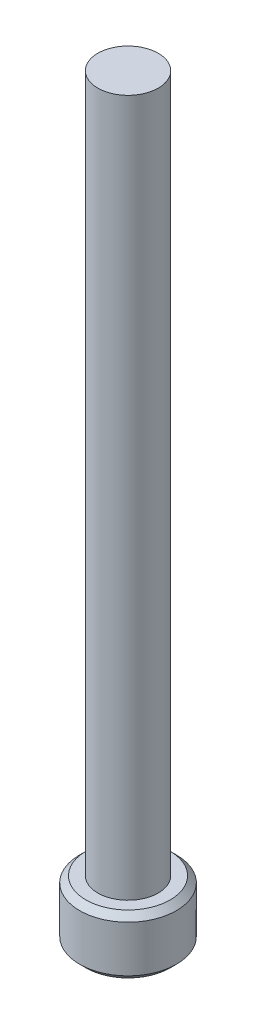
ISO-10303-21;
HEADER;
FILE_DESCRIPTION(('STEP AP214'),'2;1');
FILE_NAME('part.step','',(''),(''),'','','');
FILE_SCHEMA(('AUTOMOTIVE_DESIGN { 1 0 10303 214 1 1 1 1 }'));
ENDSEC;
DATA;
#1=APPLICATION_CONTEXT('core data for automotive mechanical design processes');
#2=APPLICATION_PROTOCOL_DEFINITION('international standard','automotive_design',2000,#1);
#3=PRODUCT_CONTEXT('',#1,'mechanical');
#4=PRODUCT('Part','Part','',(#3));
#5=PRODUCT_RELATED_PRODUCT_CATEGORY('part','',(#4));
#6=PRODUCT_DEFINITION_FORMATION('','',#4);
#7=PRODUCT_DEFINITION_CONTEXT('part definition',#1,'design');
#8=PRODUCT_DEFINITION('design','',#6,#7);
#9=PRODUCT_DEFINITION_SHAPE('','',#8);
#10=(LENGTH_UNIT() NAMED_UNIT(*) SI_UNIT(.MILLI.,.METRE.));
#11=(NAMED_UNIT(*) PLANE_ANGLE_UNIT() SI_UNIT($,.RADIAN.));
#12=(NAMED_UNIT(*) SI_UNIT($,.STERADIAN.) SOLID_ANGLE_UNIT());
#13=UNCERTAINTY_MEASURE_WITH_UNIT(LENGTH_MEASURE(1.E-05),#10,'distance_accuracy_value','');
#14=(GEOMETRIC_REPRESENTATION_CONTEXT(3) GLOBAL_UNCERTAINTY_ASSIGNED_CONTEXT((#13)) GLOBAL_UNIT_ASSIGNED_CONTEXT((#10,
#11,#12)) REPRESENTATION_CONTEXT('',''));
#15=CARTESIAN_POINT('',(0.,0.,0.));
#16=DIRECTION('',(0.,0.,1.));
#17=DIRECTION('',(1.,0.,0.));
#18=AXIS2_PLACEMENT_3D('',#15,#16,#17);
#19=CARTESIAN_POINT('',(0.,57.15,0.));
#20=DIRECTION('',(0.,-1.,0.));
#21=DIRECTION('',(0.,0.,-1.));
#22=AXIS2_PLACEMENT_3D('',#19,#20,#21);
#23=CYLINDRICAL_SURFACE('',#22,2.4765);
#24=CARTESIAN_POINT('',(0.,57.15,0.));
#25=DIRECTION('',(0.,1.,0.));
#26=DIRECTION('',(0.,0.,1.));
#27=AXIS2_PLACEMENT_3D('',#24,#25,#26);
#28=CIRCLE('',#27,2.4765);
#29=CARTESIAN_POINT('',(0.,57.15,2.4765));
#30=VERTEX_POINT('',#29);
#31=EDGE_CURVE('E150',#30,#30,#28,.T.);
#32=ORIENTED_EDGE('',*,*,#31,.F.);
#33=EDGE_LOOP('',(#32));
#34=FACE_BOUND('',#33,.T.);
#35=CARTESIAN_POINT('',(0.,0.,0.));
#36=DIRECTION('',(0.,1.,0.));
#37=DIRECTION('',(0.,0.,1.));
#38=AXIS2_PLACEMENT_3D('',#35,#36,#37);
#39=CIRCLE('',#38,2.4765);
#40=CARTESIAN_POINT('',(0.,0.,2.4765));
#41=VERTEX_POINT('',#40);
#42=EDGE_CURVE('E144',#41,#41,#39,.T.);
#43=ORIENTED_EDGE('',*,*,#42,.T.);
#44=EDGE_LOOP('',(#43));
#45=FACE_BOUND('',#44,.T.);
#46=ADVANCED_FACE('F41',(#34,#45),#23,.T.);
#47=CARTESIAN_POINT('',(0.,57.15,0.));
#48=DIRECTION('',(0.,1.,0.));
#49=DIRECTION('',(0.,0.,1.));
#50=AXIS2_PLACEMENT_3D('',#47,#48,#49);
#51=PLANE('',#50);
#52=ORIENTED_EDGE('',*,*,#31,.T.);
#53=EDGE_LOOP('',(#52));
#54=FACE_BOUND('',#53,.T.);
#55=ADVANCED_FACE('F175',(#54),#51,.T.);
#56=CARTESIAN_POINT('',(0.,-4.826,0.));
#57=DIRECTION('',(0.,1.,0.));
#58=DIRECTION('',(0.,0.,1.));
#59=AXIS2_PLACEMENT_3D('',#56,#57,#58);
#60=CYLINDRICAL_SURFACE('',#59,3.9624);
#61=CARTESIAN_POINT('',(0.,-0.507999999999989,0.));
#62=DIRECTION('',(0.,-1.,0.));
#63=DIRECTION('',(0.,0.,-1.));
#64=AXIS2_PLACEMENT_3D('',#61,#62,#63);
#65=CIRCLE('',#64,3.9624);
#66=CARTESIAN_POINT('',(0.,-0.507999999999989,-3.9624));
#67=VERTEX_POINT('',#66);
#68=EDGE_CURVE('E158',#67,#67,#65,.T.);
#69=ORIENTED_EDGE('',*,*,#68,.T.);
#70=EDGE_LOOP('',(#69));
#71=FACE_BOUND('',#70,.T.);
#72=CARTESIAN_POINT('',(0.,-4.31799999999998,0.));
#73=DIRECTION('',(0.,-1.,0.));
#74=DIRECTION('',(0.,0.,-1.));
#75=AXIS2_PLACEMENT_3D('',#72,#73,#74);
#76=CIRCLE('',#75,3.9624);
#77=CARTESIAN_POINT('',(0.,-4.31799999999998,-3.9624));
#78=VERTEX_POINT('',#77);
#79=EDGE_CURVE('E153',#78,#78,#76,.F.);
#80=ORIENTED_EDGE('',*,*,#79,.T.);
#81=EDGE_LOOP('',(#80));
#82=FACE_BOUND('',#81,.T.);
#83=ADVANCED_FACE('F171',(#71,#82),#60,.T.);
#84=CARTESIAN_POINT('',(0.,-4.826,0.));
#85=DIRECTION('',(0.,-1.,0.));
#86=DIRECTION('',(0.,0.,-1.));
#87=AXIS2_PLACEMENT_3D('',#84,#85,#86);
#88=PLANE('',#87);
#89=CARTESIAN_POINT('',(0.,-4.826,0.));
#90=DIRECTION('',(0.,-1.,0.));
#91=DIRECTION('',(0.,0.,-1.));
#92=AXIS2_PLACEMENT_3D('',#89,#90,#91);
#93=CIRCLE('',#92,3.45439999999999);
#94=CARTESIAN_POINT('',(0.,-4.826,-3.45439999999999));
#95=VERTEX_POINT('',#94);
#96=EDGE_CURVE('E11',#95,#95,#93,.T.);
#97=ORIENTED_EDGE('',*,*,#96,.T.);
#98=EDGE_LOOP('',(#97));
#99=FACE_BOUND('',#98,.T.);
#100=DIRECTION('',(0.5,0.,0.866025403784439));
#101=VECTOR('',#100,1.);
#102=CARTESIAN_POINT('',(1.14567944042316,-4.826,-1.984375));
#103=LINE('',#102,#101);
#104=CARTESIAN_POINT('',(1.14567944042316,-4.826,-1.984375));
#105=VERTEX_POINT('',#104);
#106=CARTESIAN_POINT('',(2.29135888084633,-4.826,0.));
#107=VERTEX_POINT('',#106);
#108=EDGE_CURVE('E57',#105,#107,#103,.T.);
#109=ORIENTED_EDGE('',*,*,#108,.F.);
#110=DIRECTION('',(1.,0.,0.));
#111=VECTOR('',#110,1.);
#112=CARTESIAN_POINT('',(-1.14567944042316,-4.826,-1.984375));
#113=LINE('',#112,#111);
#114=CARTESIAN_POINT('',(-1.14567944042316,-4.826,-1.984375));
#115=VERTEX_POINT('',#114);
#116=EDGE_CURVE('E140',#115,#105,#113,.T.);
#117=ORIENTED_EDGE('',*,*,#116,.F.);
#118=DIRECTION('',(0.5,0.,-0.866025403784439));
#119=VECTOR('',#118,1.);
#120=CARTESIAN_POINT('',(-2.29135888084633,-4.826,0.));
#121=LINE('',#120,#119);
#122=CARTESIAN_POINT('',(-2.29135888084633,-4.826,0.));
#123=VERTEX_POINT('',#122);
#124=EDGE_CURVE('E138',#123,#115,#121,.T.);
#125=ORIENTED_EDGE('',*,*,#124,.F.);
#126=DIRECTION('',(-0.5,0.,-0.866025403784439));
#127=VECTOR('',#126,1.);
#128=CARTESIAN_POINT('',(-1.14567944042316,-4.826,1.984375));
#129=LINE('',#128,#127);
#130=CARTESIAN_POINT('',(-1.14567944042316,-4.826,1.984375));
#131=VERTEX_POINT('',#130);
#132=EDGE_CURVE('E105',#131,#123,#129,.T.);
#133=ORIENTED_EDGE('',*,*,#132,.F.);
#134=DIRECTION('',(-1.,0.,0.));
#135=VECTOR('',#134,1.);
#136=CARTESIAN_POINT('',(1.14567944042316,-4.826,1.984375));
#137=LINE('',#136,#135);
#138=CARTESIAN_POINT('',(1.14567944042316,-4.826,1.984375));
#139=VERTEX_POINT('',#138);
#140=EDGE_CURVE('E134',#139,#131,#137,.T.);
#141=ORIENTED_EDGE('',*,*,#140,.F.);
#142=DIRECTION('',(-0.5,0.,0.866025403784439));
#143=VECTOR('',#142,1.);
#144=CARTESIAN_POINT('',(2.29135888084633,-4.826,0.));
#145=LINE('',#144,#143);
#146=EDGE_CURVE('E131',#107,#139,#145,.T.);
#147=ORIENTED_EDGE('',*,*,#146,.F.);
#148=EDGE_LOOP('',(#109,#117,#125,#133,#141,#147));
#149=FACE_BOUND('',#148,.T.);
#150=ADVANCED_FACE('F174',(#99,#149),#88,.T.);
#151=CARTESIAN_POINT('',(0.,0.,0.));
#152=DIRECTION('',(0.,-1.,0.));
#153=DIRECTION('',(0.,0.,-1.));
#154=AXIS2_PLACEMENT_3D('',#151,#152,#153);
#155=PLANE('',#154);
#156=CARTESIAN_POINT('',(0.,0.,0.));
#157=DIRECTION('',(0.,-1.,0.));
#158=DIRECTION('',(0.,0.,-1.));
#159=AXIS2_PLACEMENT_3D('',#156,#157,#158);
#160=CIRCLE('',#159,3.45440000000001);
#161=CARTESIAN_POINT('',(0.,0.,-3.45440000000001));
#162=VERTEX_POINT('',#161);
#163=EDGE_CURVE('E50',#162,#162,#160,.F.);
#164=ORIENTED_EDGE('',*,*,#163,.T.);
#165=EDGE_LOOP('',(#164));
#166=FACE_BOUND('',#165,.T.);
#167=ORIENTED_EDGE('',*,*,#42,.F.);
#168=EDGE_LOOP('',(#167));
#169=FACE_BOUND('',#168,.T.);
#170=ADVANCED_FACE('F163',(#166,#169),#155,.F.);
#171=CARTESIAN_POINT('',(1.14567944042316,-2.54,-1.984375));
#172=DIRECTION('',(0.866025403784439,0.,-0.5));
#173=DIRECTION('',(-0.5,0.,-0.866025403784439));
#174=AXIS2_PLACEMENT_3D('',#171,#172,#173);
#175=PLANE('',#174);
#176=ORIENTED_EDGE('',*,*,#108,.T.);
#177=DIRECTION('',(0.,-1.,0.));
#178=VECTOR('',#177,1.);
#179=CARTESIAN_POINT('',(2.29135888084633,-2.54,0.));
#180=LINE('',#179,#178);
#181=CARTESIAN_POINT('',(2.29135888084633,-2.54,0.));
#182=VERTEX_POINT('',#181);
#183=EDGE_CURVE('E87',#182,#107,#180,.T.);
#184=ORIENTED_EDGE('',*,*,#183,.F.);
#185=DIRECTION('',(0.5,0.,0.866025403784439));
#186=VECTOR('',#185,1.);
#187=CARTESIAN_POINT('',(1.14567944042316,-2.54,-1.984375));
#188=LINE('',#187,#186);
#189=CARTESIAN_POINT('',(1.14567944042316,-2.54,-1.984375));
#190=VERTEX_POINT('',#189);
#191=EDGE_CURVE('E142',#190,#182,#188,.T.);
#192=ORIENTED_EDGE('',*,*,#191,.F.);
#193=DIRECTION('',(0.,-1.,0.));
#194=VECTOR('',#193,1.);
#195=CARTESIAN_POINT('',(1.14567944042316,-2.54,-1.984375));
#196=LINE('',#195,#194);
#197=EDGE_CURVE('E65',#190,#105,#196,.T.);
#198=ORIENTED_EDGE('',*,*,#197,.T.);
#199=EDGE_LOOP('',(#176,#184,#192,#198));
#200=FACE_BOUND('',#199,.T.);
#201=ADVANCED_FACE('F192',(#200),#175,.F.);
#202=CARTESIAN_POINT('',(-1.14567944042316,-2.54,-1.984375));
#203=DIRECTION('',(0.,0.,-1.));
#204=DIRECTION('',(-1.,0.,0.));
#205=AXIS2_PLACEMENT_3D('',#202,#203,#204);
#206=PLANE('',#205);
#207=ORIENTED_EDGE('',*,*,#116,.T.);
#208=ORIENTED_EDGE('',*,*,#197,.F.);
#209=DIRECTION('',(1.,0.,0.));
#210=VECTOR('',#209,1.);
#211=CARTESIAN_POINT('',(-1.14567944042316,-2.54,-1.984375));
#212=LINE('',#211,#210);
#213=CARTESIAN_POINT('',(-1.14567944042316,-2.54,-1.984375));
#214=VERTEX_POINT('',#213);
#215=EDGE_CURVE('E117',#214,#190,#212,.T.);
#216=ORIENTED_EDGE('',*,*,#215,.F.);
#217=DIRECTION('',(0.,-1.,0.));
#218=VECTOR('',#217,1.);
#219=CARTESIAN_POINT('',(-1.14567944042316,-2.54,-1.984375));
#220=LINE('',#219,#218);
#221=EDGE_CURVE('E109',#214,#115,#220,.T.);
#222=ORIENTED_EDGE('',*,*,#221,.T.);
#223=EDGE_LOOP('',(#207,#208,#216,#222));
#224=FACE_BOUND('',#223,.T.);
#225=ADVANCED_FACE('F194',(#224),#206,.F.);
#226=CARTESIAN_POINT('',(-2.29135888084633,-2.54,0.));
#227=DIRECTION('',(-0.866025403784439,0.,-0.5));
#228=DIRECTION('',(-0.5,0.,0.866025403784439));
#229=AXIS2_PLACEMENT_3D('',#226,#227,#228);
#230=PLANE('',#229);
#231=ORIENTED_EDGE('',*,*,#124,.T.);
#232=ORIENTED_EDGE('',*,*,#221,.F.);
#233=DIRECTION('',(0.5,0.,-0.866025403784439));
#234=VECTOR('',#233,1.);
#235=CARTESIAN_POINT('',(-2.29135888084633,-2.54,0.));
#236=LINE('',#235,#234);
#237=CARTESIAN_POINT('',(-2.29135888084633,-2.54,0.));
#238=VERTEX_POINT('',#237);
#239=EDGE_CURVE('E113',#238,#214,#236,.T.);
#240=ORIENTED_EDGE('',*,*,#239,.F.);
#241=DIRECTION('',(0.,-1.,0.));
#242=VECTOR('',#241,1.);
#243=CARTESIAN_POINT('',(-2.29135888084633,-2.54,0.));
#244=LINE('',#243,#242);
#245=EDGE_CURVE('E98',#238,#123,#244,.T.);
#246=ORIENTED_EDGE('',*,*,#245,.T.);
#247=EDGE_LOOP('',(#231,#232,#240,#246));
#248=FACE_BOUND('',#247,.T.);
#249=ADVANCED_FACE('F114',(#248),#230,.F.);
#250=CARTESIAN_POINT('',(-1.14567944042316,-2.54,1.984375));
#251=DIRECTION('',(-0.866025403784439,0.,0.5));
#252=DIRECTION('',(0.5,0.,0.866025403784439));
#253=AXIS2_PLACEMENT_3D('',#250,#251,#252);
#254=PLANE('',#253);
#255=ORIENTED_EDGE('',*,*,#132,.T.);
#256=ORIENTED_EDGE('',*,*,#245,.F.);
#257=DIRECTION('',(-0.5,0.,-0.866025403784439));
#258=VECTOR('',#257,1.);
#259=CARTESIAN_POINT('',(-1.14567944042316,-2.54,1.984375));
#260=LINE('',#259,#258);
#261=CARTESIAN_POINT('',(-1.14567944042316,-2.54,1.984375));
#262=VERTEX_POINT('',#261);
#263=EDGE_CURVE('E102',#262,#238,#260,.T.);
#264=ORIENTED_EDGE('',*,*,#263,.F.);
#265=DIRECTION('',(0.,-1.,0.));
#266=VECTOR('',#265,1.);
#267=CARTESIAN_POINT('',(-1.14567944042316,-2.54,1.984375));
#268=LINE('',#267,#266);
#269=EDGE_CURVE('E110',#262,#131,#268,.T.);
#270=ORIENTED_EDGE('',*,*,#269,.T.);
#271=EDGE_LOOP('',(#255,#256,#264,#270));
#272=FACE_BOUND('',#271,.T.);
#273=ADVANCED_FACE('F100',(#272),#254,.F.);
#274=CARTESIAN_POINT('',(1.14567944042316,-2.54,1.984375));
#275=DIRECTION('',(0.,0.,1.));
#276=DIRECTION('',(1.,0.,0.));
#277=AXIS2_PLACEMENT_3D('',#274,#275,#276);
#278=PLANE('',#277);
#279=ORIENTED_EDGE('',*,*,#140,.T.);
#280=ORIENTED_EDGE('',*,*,#269,.F.);
#281=DIRECTION('',(-1.,0.,0.));
#282=VECTOR('',#281,1.);
#283=CARTESIAN_POINT('',(1.14567944042316,-2.54,1.984375));
#284=LINE('',#283,#282);
#285=CARTESIAN_POINT('',(1.14567944042316,-2.54,1.984375));
#286=VERTEX_POINT('',#285);
#287=EDGE_CURVE('E123',#286,#262,#284,.T.);
#288=ORIENTED_EDGE('',*,*,#287,.F.);
#289=DIRECTION('',(0.,-1.,0.));
#290=VECTOR('',#289,1.);
#291=CARTESIAN_POINT('',(1.14567944042316,-2.54,1.984375));
#292=LINE('',#291,#290);
#293=EDGE_CURVE('E147',#286,#139,#292,.T.);
#294=ORIENTED_EDGE('',*,*,#293,.T.);
#295=EDGE_LOOP('',(#279,#280,#288,#294));
#296=FACE_BOUND('',#295,.T.);
#297=ADVANCED_FACE('F271',(#296),#278,.F.);
#298=CARTESIAN_POINT('',(2.29135888084633,-2.54,0.));
#299=DIRECTION('',(0.866025403784439,0.,0.5));
#300=DIRECTION('',(0.5,0.,-0.866025403784439));
#301=AXIS2_PLACEMENT_3D('',#298,#299,#300);
#302=PLANE('',#301);
#303=ORIENTED_EDGE('',*,*,#146,.T.);
#304=ORIENTED_EDGE('',*,*,#293,.F.);
#305=DIRECTION('',(-0.5,0.,0.866025403784439));
#306=VECTOR('',#305,1.);
#307=CARTESIAN_POINT('',(2.29135888084633,-2.54,0.));
#308=LINE('',#307,#306);
#309=EDGE_CURVE('E125',#182,#286,#308,.T.);
#310=ORIENTED_EDGE('',*,*,#309,.F.);
#311=ORIENTED_EDGE('',*,*,#183,.T.);
#312=EDGE_LOOP('',(#303,#304,#310,#311));
#313=FACE_BOUND('',#312,.T.);
#314=ADVANCED_FACE('F190',(#313),#302,.F.);
#315=CARTESIAN_POINT('',(0.,-2.54,0.));
#316=DIRECTION('',(0.,-1.,0.));
#317=DIRECTION('',(0.,0.,-1.));
#318=AXIS2_PLACEMENT_3D('',#315,#316,#317);
#319=PLANE('',#318);
#320=ORIENTED_EDGE('',*,*,#191,.T.);
#321=ORIENTED_EDGE('',*,*,#309,.T.);
#322=ORIENTED_EDGE('',*,*,#287,.T.);
#323=ORIENTED_EDGE('',*,*,#263,.T.);
#324=ORIENTED_EDGE('',*,*,#239,.T.);
#325=ORIENTED_EDGE('',*,*,#215,.T.);
#326=EDGE_LOOP('',(#320,#321,#322,#323,#324,#325));
#327=FACE_BOUND('',#326,.T.);
#328=ADVANCED_FACE('F120',(#327),#319,.T.);
#329=CARTESIAN_POINT('',(0.,-0.507999999999989,0.));
#330=DIRECTION('',(0.,-1.,0.));
#331=DIRECTION('',(0.,0.,-1.));
#332=AXIS2_PLACEMENT_3D('',#329,#330,#331);
#333=CONICAL_SURFACE('',#332,3.9624,0.785398163397448);
#334=ORIENTED_EDGE('',*,*,#163,.F.);
#335=EDGE_LOOP('',(#334));
#336=FACE_BOUND('',#335,.T.);
#337=ORIENTED_EDGE('',*,*,#68,.F.);
#338=EDGE_LOOP('',(#337));
#339=FACE_BOUND('',#338,.T.);
#340=ADVANCED_FACE('F166',(#336,#339),#333,.T.);
#341=CARTESIAN_POINT('',(0.,-4.826,0.));
#342=DIRECTION('',(0.,1.,0.));
#343=DIRECTION('',(0.,0.,1.));
#344=AXIS2_PLACEMENT_3D('',#341,#342,#343);
#345=CONICAL_SURFACE('',#344,3.45439999999999,0.785398163397442);
#346=ORIENTED_EDGE('',*,*,#79,.F.);
#347=EDGE_LOOP('',(#346));
#348=FACE_BOUND('',#347,.T.);
#349=ORIENTED_EDGE('',*,*,#96,.F.);
#350=EDGE_LOOP('',(#349));
#351=FACE_BOUND('',#350,.T.);
#352=ADVANCED_FACE('F44',(#348,#351),#345,.T.);
#353=CLOSED_SHELL('',(#46,#55,#83,#150,#170,#201,#225,#249,#273,#297,#314,#328,#340,#352));
#354=MANIFOLD_SOLID_BREP('B2',#353);
#355=ADVANCED_BREP_SHAPE_REPRESENTATION('',(#18,#354),#14);
#356=SHAPE_DEFINITION_REPRESENTATION(#9,#355);
ENDSEC;
END-ISO-10303-21;
